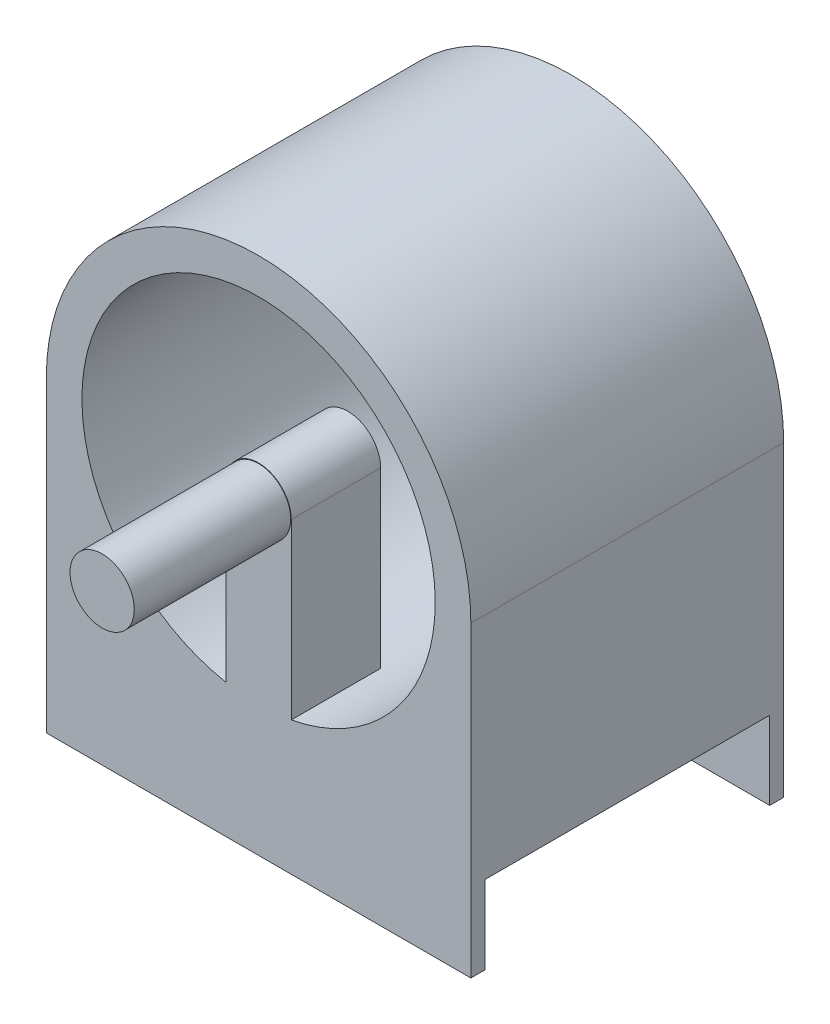
ISO-10303-21;
HEADER;
FILE_DESCRIPTION(('STEP AP214'),'2;1');
FILE_NAME('part.step','',(''),(''),'','','');
FILE_SCHEMA(('AUTOMOTIVE_DESIGN { 1 0 10303 214 1 1 1 1 }'));
ENDSEC;
DATA;
#1=APPLICATION_CONTEXT('core data for automotive mechanical design processes');
#2=APPLICATION_PROTOCOL_DEFINITION('international standard','automotive_design',2000,#1);
#3=PRODUCT_CONTEXT('',#1,'mechanical');
#4=PRODUCT('Part','Part','',(#3));
#5=PRODUCT_RELATED_PRODUCT_CATEGORY('part','',(#4));
#6=PRODUCT_DEFINITION_FORMATION('','',#4);
#7=PRODUCT_DEFINITION_CONTEXT('part definition',#1,'design');
#8=PRODUCT_DEFINITION('design','',#6,#7);
#9=PRODUCT_DEFINITION_SHAPE('','',#8);
#10=(LENGTH_UNIT() NAMED_UNIT(*) SI_UNIT(.MILLI.,.METRE.));
#11=(NAMED_UNIT(*) PLANE_ANGLE_UNIT() SI_UNIT($,.RADIAN.));
#12=(NAMED_UNIT(*) SI_UNIT($,.STERADIAN.) SOLID_ANGLE_UNIT());
#13=UNCERTAINTY_MEASURE_WITH_UNIT(LENGTH_MEASURE(1.E-05),#10,'distance_accuracy_value','');
#14=(GEOMETRIC_REPRESENTATION_CONTEXT(3) GLOBAL_UNCERTAINTY_ASSIGNED_CONTEXT((#13)) GLOBAL_UNIT_ASSIGNED_CONTEXT((#10,
#11,#12)) REPRESENTATION_CONTEXT('',''));
#15=CARTESIAN_POINT('',(0.,0.,0.));
#16=DIRECTION('',(0.,0.,1.));
#17=DIRECTION('',(1.,0.,0.));
#18=AXIS2_PLACEMENT_3D('',#15,#16,#17);
#19=CARTESIAN_POINT('',(19.,27.5,-14.));
#20=DIRECTION('',(0.,0.,1.));
#21=DIRECTION('',(1.,0.,0.));
#22=AXIS2_PLACEMENT_3D('',#19,#20,#21);
#23=CYLINDRICAL_SURFACE('',#22,15.81);
#24=CARTESIAN_POINT('',(19.,27.5,-14.));
#25=DIRECTION('',(0.,0.,1.));
#26=DIRECTION('',(1.,0.,0.));
#27=AXIS2_PLACEMENT_3D('',#24,#25,#26);
#28=CIRCLE('',#27,15.81);
#29=CARTESIAN_POINT('',(34.81,27.5,-14.));
#30=VERTEX_POINT('',#29);
#31=EDGE_CURVE('E178',#30,#30,#28,.T.);
#32=ORIENTED_EDGE('',*,*,#31,.F.);
#33=EDGE_LOOP('',(#32));
#34=FACE_BOUND('',#33,.T.);
#35=DIRECTION('',(0.,0.,1.));
#36=VECTOR('',#35,1.);
#37=CARTESIAN_POINT('',(21.925,11.9629322264463,6.));
#38=LINE('',#37,#36);
#39=CARTESIAN_POINT('',(21.925,11.9629322264463,6.));
#40=VERTEX_POINT('',#39);
#41=CARTESIAN_POINT('',(21.925,11.9629322264463,14.));
#42=VERTEX_POINT('',#41);
#43=EDGE_CURVE('E174',#40,#42,#38,.T.);
#44=ORIENTED_EDGE('',*,*,#43,.T.);
#45=CARTESIAN_POINT('',(19.,27.5,14.));
#46=DIRECTION('',(0.,0.,1.));
#47=DIRECTION('',(1.,0.,0.));
#48=AXIS2_PLACEMENT_3D('',#45,#46,#47);
#49=CIRCLE('',#48,15.81);
#50=CARTESIAN_POINT('',(16.075,11.9629322264463,14.));
#51=VERTEX_POINT('',#50);
#52=EDGE_CURVE('E177',#42,#51,#49,.T.);
#53=ORIENTED_EDGE('',*,*,#52,.T.);
#54=DIRECTION('',(0.,0.,1.));
#55=VECTOR('',#54,1.);
#56=CARTESIAN_POINT('',(16.075,11.9629322264463,6.));
#57=LINE('',#56,#55);
#58=CARTESIAN_POINT('',(16.075,11.9629322264463,6.));
#59=VERTEX_POINT('',#58);
#60=EDGE_CURVE('E61',#59,#51,#57,.T.);
#61=ORIENTED_EDGE('',*,*,#60,.F.);
#62=CARTESIAN_POINT('',(19.,27.5,6.));
#63=DIRECTION('',(0.,0.,1.));
#64=DIRECTION('',(1.,0.,0.));
#65=AXIS2_PLACEMENT_3D('',#62,#63,#64);
#66=CIRCLE('',#65,15.81);
#67=EDGE_CURVE('E65',#59,#40,#66,.T.);
#68=ORIENTED_EDGE('',*,*,#67,.T.);
#69=EDGE_LOOP('',(#44,#53,#61,#68));
#70=FACE_BOUND('',#69,.T.);
#71=ADVANCED_FACE('F45',(#34,#70),#23,.F.);
#72=CARTESIAN_POINT('',(38.,0.,14.));
#73=DIRECTION('',(0.,1.,0.));
#74=DIRECTION('',(0.,0.,1.));
#75=AXIS2_PLACEMENT_3D('',#72,#73,#74);
#76=PLANE('',#75);
#77=DIRECTION('',(0.,0.,-1.));
#78=VECTOR('',#77,1.);
#79=CARTESIAN_POINT('',(0.,0.,14.));
#80=LINE('',#79,#78);
#81=CARTESIAN_POINT('',(0.,0.,14.));
#82=VERTEX_POINT('',#81);
#83=CARTESIAN_POINT('',(0.,0.,12.75));
#84=VERTEX_POINT('',#83);
#85=EDGE_CURVE('E200',#82,#84,#80,.T.);
#86=ORIENTED_EDGE('',*,*,#85,.T.);
#87=DIRECTION('',(-1.,0.,0.));
#88=VECTOR('',#87,1.);
#89=CARTESIAN_POINT('',(38.,0.,12.75));
#90=LINE('',#89,#88);
#91=CARTESIAN_POINT('',(38.,0.,12.75));
#92=VERTEX_POINT('',#91);
#93=EDGE_CURVE('E54',#92,#84,#90,.T.);
#94=ORIENTED_EDGE('',*,*,#93,.F.);
#95=DIRECTION('',(0.,0.,-1.));
#96=VECTOR('',#95,1.);
#97=CARTESIAN_POINT('',(38.,0.,14.));
#98=LINE('',#97,#96);
#99=CARTESIAN_POINT('',(38.,0.,14.));
#100=VERTEX_POINT('',#99);
#101=EDGE_CURVE('E201',#100,#92,#98,.T.);
#102=ORIENTED_EDGE('',*,*,#101,.F.);
#103=DIRECTION('',(-1.,0.,0.));
#104=VECTOR('',#103,1.);
#105=CARTESIAN_POINT('',(38.,0.,14.));
#106=LINE('',#105,#104);
#107=EDGE_CURVE('E224',#100,#82,#106,.T.);
#108=ORIENTED_EDGE('',*,*,#107,.T.);
#109=EDGE_LOOP('',(#86,#94,#102,#108));
#110=FACE_BOUND('',#109,.T.);
#111=ADVANCED_FACE('F47',(#110),#76,.F.);
#112=CARTESIAN_POINT('',(38.,0.,12.75));
#113=DIRECTION('',(0.,0.,1.));
#114=DIRECTION('',(1.,0.,0.));
#115=AXIS2_PLACEMENT_3D('',#112,#113,#114);
#116=PLANE('',#115);
#117=DIRECTION('',(0.,1.,0.));
#118=VECTOR('',#117,1.);
#119=CARTESIAN_POINT('',(0.,0.,12.75));
#120=LINE('',#119,#118);
#121=CARTESIAN_POINT('',(0.,7.,12.75));
#122=VERTEX_POINT('',#121);
#123=EDGE_CURVE('E228',#84,#122,#120,.T.);
#124=ORIENTED_EDGE('',*,*,#123,.T.);
#125=DIRECTION('',(-1.,0.,0.));
#126=VECTOR('',#125,1.);
#127=CARTESIAN_POINT('',(38.,7.,12.75));
#128=LINE('',#127,#126);
#129=CARTESIAN_POINT('',(38.,7.,12.75));
#130=VERTEX_POINT('',#129);
#131=EDGE_CURVE('E260',#130,#122,#128,.T.);
#132=ORIENTED_EDGE('',*,*,#131,.F.);
#133=DIRECTION('',(0.,1.,0.));
#134=VECTOR('',#133,1.);
#135=CARTESIAN_POINT('',(38.,0.,12.75));
#136=LINE('',#135,#134);
#137=EDGE_CURVE('E205',#92,#130,#136,.T.);
#138=ORIENTED_EDGE('',*,*,#137,.F.);
#139=ORIENTED_EDGE('',*,*,#93,.T.);
#140=EDGE_LOOP('',(#124,#132,#138,#139));
#141=FACE_BOUND('',#140,.T.);
#142=ADVANCED_FACE('F267',(#141),#116,.F.);
#143=CARTESIAN_POINT('',(38.,7.,12.75));
#144=DIRECTION('',(0.,1.,0.));
#145=DIRECTION('',(0.,0.,1.));
#146=AXIS2_PLACEMENT_3D('',#143,#144,#145);
#147=PLANE('',#146);
#148=DIRECTION('',(0.,0.,-1.));
#149=VECTOR('',#148,1.);
#150=CARTESIAN_POINT('',(0.,7.,12.75));
#151=LINE('',#150,#149);
#152=CARTESIAN_POINT('',(0.,7.,-12.75));
#153=VERTEX_POINT('',#152);
#154=EDGE_CURVE('E231',#122,#153,#151,.T.);
#155=ORIENTED_EDGE('',*,*,#154,.T.);
#156=DIRECTION('',(-1.,0.,0.));
#157=VECTOR('',#156,1.);
#158=CARTESIAN_POINT('',(38.,7.,-12.75));
#159=LINE('',#158,#157);
#160=CARTESIAN_POINT('',(38.,7.,-12.75));
#161=VERTEX_POINT('',#160);
#162=EDGE_CURVE('E256',#161,#153,#159,.T.);
#163=ORIENTED_EDGE('',*,*,#162,.F.);
#164=DIRECTION('',(0.,0.,-1.));
#165=VECTOR('',#164,1.);
#166=CARTESIAN_POINT('',(38.,7.,12.75));
#167=LINE('',#166,#165);
#168=EDGE_CURVE('E209',#130,#161,#167,.T.);
#169=ORIENTED_EDGE('',*,*,#168,.F.);
#170=ORIENTED_EDGE('',*,*,#131,.T.);
#171=EDGE_LOOP('',(#155,#163,#169,#170));
#172=FACE_BOUND('',#171,.T.);
#173=ADVANCED_FACE('F280',(#172),#147,.F.);
#174=CARTESIAN_POINT('',(38.,7.,-12.75));
#175=DIRECTION('',(0.,0.,-1.));
#176=DIRECTION('',(0.,1.,0.));
#177=AXIS2_PLACEMENT_3D('',#174,#175,#176);
#178=PLANE('',#177);
#179=DIRECTION('',(0.,-1.,0.));
#180=VECTOR('',#179,1.);
#181=CARTESIAN_POINT('',(0.,7.,-12.75));
#182=LINE('',#181,#180);
#183=CARTESIAN_POINT('',(0.,0.,-12.75));
#184=VERTEX_POINT('',#183);
#185=EDGE_CURVE('E234',#153,#184,#182,.T.);
#186=ORIENTED_EDGE('',*,*,#185,.T.);
#187=DIRECTION('',(-1.,0.,0.));
#188=VECTOR('',#187,1.);
#189=CARTESIAN_POINT('',(38.,0.,-12.75));
#190=LINE('',#189,#188);
#191=CARTESIAN_POINT('',(38.,0.,-12.75));
#192=VERTEX_POINT('',#191);
#193=EDGE_CURVE('E252',#192,#184,#190,.T.);
#194=ORIENTED_EDGE('',*,*,#193,.F.);
#195=DIRECTION('',(0.,-1.,0.));
#196=VECTOR('',#195,1.);
#197=CARTESIAN_POINT('',(38.,7.,-12.75));
#198=LINE('',#197,#196);
#199=EDGE_CURVE('E212',#161,#192,#198,.T.);
#200=ORIENTED_EDGE('',*,*,#199,.F.);
#201=ORIENTED_EDGE('',*,*,#162,.T.);
#202=EDGE_LOOP('',(#186,#194,#200,#201));
#203=FACE_BOUND('',#202,.T.);
#204=ADVANCED_FACE('F284',(#203),#178,.F.);
#205=CARTESIAN_POINT('',(38.,0.,-12.75));
#206=DIRECTION('',(0.,1.,0.));
#207=DIRECTION('',(0.,0.,1.));
#208=AXIS2_PLACEMENT_3D('',#205,#206,#207);
#209=PLANE('',#208);
#210=DIRECTION('',(0.,0.,-1.));
#211=VECTOR('',#210,1.);
#212=CARTESIAN_POINT('',(0.,0.,-12.75));
#213=LINE('',#212,#211);
#214=CARTESIAN_POINT('',(0.,0.,-14.));
#215=VERTEX_POINT('',#214);
#216=EDGE_CURVE('E237',#184,#215,#213,.T.);
#217=ORIENTED_EDGE('',*,*,#216,.T.);
#218=DIRECTION('',(-1.,0.,0.));
#219=VECTOR('',#218,1.);
#220=CARTESIAN_POINT('',(38.,0.,-14.));
#221=LINE('',#220,#219);
#222=CARTESIAN_POINT('',(38.,0.,-14.));
#223=VERTEX_POINT('',#222);
#224=EDGE_CURVE('E248',#223,#215,#221,.T.);
#225=ORIENTED_EDGE('',*,*,#224,.F.);
#226=DIRECTION('',(0.,0.,-1.));
#227=VECTOR('',#226,1.);
#228=CARTESIAN_POINT('',(38.,0.,-12.75));
#229=LINE('',#228,#227);
#230=EDGE_CURVE('E215',#192,#223,#229,.T.);
#231=ORIENTED_EDGE('',*,*,#230,.F.);
#232=ORIENTED_EDGE('',*,*,#193,.T.);
#233=EDGE_LOOP('',(#217,#225,#231,#232));
#234=FACE_BOUND('',#233,.T.);
#235=ADVANCED_FACE('F303',(#234),#209,.F.);
#236=CARTESIAN_POINT('',(38.,0.,-14.));
#237=DIRECTION('',(0.,0.,1.));
#238=DIRECTION('',(1.,0.,0.));
#239=AXIS2_PLACEMENT_3D('',#236,#237,#238);
#240=PLANE('',#239);
#241=ORIENTED_EDGE('',*,*,#31,.T.);
#242=EDGE_LOOP('',(#241));
#243=FACE_BOUND('',#242,.T.);
#244=DIRECTION('',(0.,1.,0.));
#245=VECTOR('',#244,1.);
#246=CARTESIAN_POINT('',(0.,0.,-14.));
#247=LINE('',#246,#245);
#248=CARTESIAN_POINT('',(0.,27.5,-14.));
#249=VERTEX_POINT('',#248);
#250=EDGE_CURVE('E240',#215,#249,#247,.T.);
#251=ORIENTED_EDGE('',*,*,#250,.T.);
#252=CARTESIAN_POINT('',(19.,27.5,-14.));
#253=DIRECTION('',(0.,0.,1.));
#254=DIRECTION('',(1.,0.,0.));
#255=AXIS2_PLACEMENT_3D('',#252,#253,#254);
#256=CIRCLE('',#255,19.);
#257=CARTESIAN_POINT('',(38.,27.5,-14.));
#258=VERTEX_POINT('',#257);
#259=EDGE_CURVE('E182',#258,#249,#256,.T.);
#260=ORIENTED_EDGE('',*,*,#259,.F.);
#261=DIRECTION('',(0.,1.,0.));
#262=VECTOR('',#261,1.);
#263=CARTESIAN_POINT('',(38.,0.,-14.));
#264=LINE('',#263,#262);
#265=EDGE_CURVE('E218',#223,#258,#264,.T.);
#266=ORIENTED_EDGE('',*,*,#265,.F.);
#267=ORIENTED_EDGE('',*,*,#224,.T.);
#268=EDGE_LOOP('',(#251,#260,#266,#267));
#269=FACE_BOUND('',#268,.T.);
#270=ADVANCED_FACE('F300',(#243,#269),#240,.F.);
#271=CARTESIAN_POINT('',(38.,8.5,14.));
#272=DIRECTION('',(0.,0.,-1.));
#273=DIRECTION('',(-1.,0.,0.));
#274=AXIS2_PLACEMENT_3D('',#271,#272,#273);
#275=PLANE('',#274);
#276=CARTESIAN_POINT('',(19.,27.5,14.));
#277=DIRECTION('',(0.,0.,-1.));
#278=DIRECTION('',(-1.,0.,0.));
#279=AXIS2_PLACEMENT_3D('',#276,#277,#278);
#280=CIRCLE('',#279,2.875);
#281=CARTESIAN_POINT('',(16.125,27.5,14.));
#282=VERTEX_POINT('',#281);
#283=EDGE_CURVE('E11',#282,#282,#280,.F.);
#284=ORIENTED_EDGE('',*,*,#283,.F.);
#285=EDGE_LOOP('',(#284));
#286=FACE_BOUND('',#285,.T.);
#287=ORIENTED_EDGE('',*,*,#52,.F.);
#288=DIRECTION('',(0.,-1.,0.));
#289=VECTOR('',#288,1.);
#290=CARTESIAN_POINT('',(21.925,27.5,14.));
#291=LINE('',#290,#289);
#292=CARTESIAN_POINT('',(21.925,27.5,14.));
#293=VERTEX_POINT('',#292);
#294=EDGE_CURVE('E161',#293,#42,#291,.T.);
#295=ORIENTED_EDGE('',*,*,#294,.F.);
#296=CARTESIAN_POINT('',(19.,27.5,14.));
#297=DIRECTION('',(0.,0.,1.));
#298=DIRECTION('',(1.,0.,0.));
#299=AXIS2_PLACEMENT_3D('',#296,#297,#298);
#300=CIRCLE('',#299,2.925);
#301=CARTESIAN_POINT('',(16.075,27.5,14.));
#302=VERTEX_POINT('',#301);
#303=EDGE_CURVE('E168',#293,#302,#300,.T.);
#304=ORIENTED_EDGE('',*,*,#303,.T.);
#305=DIRECTION('',(0.,-1.,0.));
#306=VECTOR('',#305,1.);
#307=CARTESIAN_POINT('',(16.075,27.5,14.));
#308=LINE('',#307,#306);
#309=EDGE_CURVE('E139',#302,#51,#308,.T.);
#310=ORIENTED_EDGE('',*,*,#309,.T.);
#311=EDGE_LOOP('',(#287,#295,#304,#310));
#312=FACE_BOUND('',#311,.T.);
#313=DIRECTION('',(0.,-1.,0.));
#314=VECTOR('',#313,1.);
#315=CARTESIAN_POINT('',(0.,8.5,14.));
#316=LINE('',#315,#314);
#317=CARTESIAN_POINT('',(0.,27.5,14.));
#318=VERTEX_POINT('',#317);
#319=EDGE_CURVE('E206',#318,#82,#316,.T.);
#320=ORIENTED_EDGE('',*,*,#319,.T.);
#321=ORIENTED_EDGE('',*,*,#107,.F.);
#322=DIRECTION('',(0.,-1.,0.));
#323=VECTOR('',#322,1.);
#324=CARTESIAN_POINT('',(38.,8.5,14.));
#325=LINE('',#324,#323);
#326=CARTESIAN_POINT('',(38.,27.5,14.));
#327=VERTEX_POINT('',#326);
#328=EDGE_CURVE('E221',#327,#100,#325,.T.);
#329=ORIENTED_EDGE('',*,*,#328,.F.);
#330=CARTESIAN_POINT('',(19.,27.5,14.));
#331=DIRECTION('',(0.,0.,1.));
#332=DIRECTION('',(1.,0.,0.));
#333=AXIS2_PLACEMENT_3D('',#330,#331,#332);
#334=CIRCLE('',#333,19.);
#335=EDGE_CURVE('E185',#327,#318,#334,.T.);
#336=ORIENTED_EDGE('',*,*,#335,.T.);
#337=EDGE_LOOP('',(#320,#321,#329,#336));
#338=FACE_BOUND('',#337,.T.);
#339=ADVANCED_FACE('F293',(#286,#312,#338),#275,.F.);
#340=CARTESIAN_POINT('',(38.,0.,0.));
#341=DIRECTION('',(1.,0.,0.));
#342=DIRECTION('',(0.,0.,-1.));
#343=AXIS2_PLACEMENT_3D('',#340,#341,#342);
#344=PLANE('',#343);
#345=ORIENTED_EDGE('',*,*,#101,.T.);
#346=ORIENTED_EDGE('',*,*,#137,.T.);
#347=ORIENTED_EDGE('',*,*,#168,.T.);
#348=ORIENTED_EDGE('',*,*,#199,.T.);
#349=ORIENTED_EDGE('',*,*,#230,.T.);
#350=ORIENTED_EDGE('',*,*,#265,.T.);
#351=DIRECTION('',(0.,0.,-1.));
#352=VECTOR('',#351,1.);
#353=CARTESIAN_POINT('',(38.,27.5,14.));
#354=LINE('',#353,#352);
#355=EDGE_CURVE('E189',#327,#258,#354,.T.);
#356=ORIENTED_EDGE('',*,*,#355,.F.);
#357=ORIENTED_EDGE('',*,*,#328,.T.);
#358=EDGE_LOOP('',(#345,#346,#347,#348,#349,#350,#356,#357));
#359=FACE_BOUND('',#358,.T.);
#360=ADVANCED_FACE('F288',(#359),#344,.T.);
#361=CARTESIAN_POINT('',(0.,0.,0.));
#362=DIRECTION('',(1.,0.,0.));
#363=DIRECTION('',(0.,0.,-1.));
#364=AXIS2_PLACEMENT_3D('',#361,#362,#363);
#365=PLANE('',#364);
#366=ORIENTED_EDGE('',*,*,#85,.F.);
#367=ORIENTED_EDGE('',*,*,#319,.F.);
#368=DIRECTION('',(0.,0.,-1.));
#369=VECTOR('',#368,1.);
#370=CARTESIAN_POINT('',(0.,27.5,14.));
#371=LINE('',#370,#369);
#372=EDGE_CURVE('E196',#318,#249,#371,.T.);
#373=ORIENTED_EDGE('',*,*,#372,.T.);
#374=ORIENTED_EDGE('',*,*,#250,.F.);
#375=ORIENTED_EDGE('',*,*,#216,.F.);
#376=ORIENTED_EDGE('',*,*,#185,.F.);
#377=ORIENTED_EDGE('',*,*,#154,.F.);
#378=ORIENTED_EDGE('',*,*,#123,.F.);
#379=EDGE_LOOP('',(#366,#367,#373,#374,#375,#376,#377,#378));
#380=FACE_BOUND('',#379,.T.);
#381=ADVANCED_FACE('F274',(#380),#365,.F.);
#382=CARTESIAN_POINT('',(19.,27.5,14.));
#383=DIRECTION('',(0.,0.,-1.));
#384=DIRECTION('',(-1.,0.,0.));
#385=AXIS2_PLACEMENT_3D('',#382,#383,#384);
#386=CYLINDRICAL_SURFACE('',#385,19.);
#387=ORIENTED_EDGE('',*,*,#259,.T.);
#388=ORIENTED_EDGE('',*,*,#372,.F.);
#389=ORIENTED_EDGE('',*,*,#335,.F.);
#390=ORIENTED_EDGE('',*,*,#355,.T.);
#391=EDGE_LOOP('',(#387,#388,#389,#390));
#392=FACE_BOUND('',#391,.T.);
#393=ADVANCED_FACE('F296',(#392),#386,.T.);
#394=CARTESIAN_POINT('',(21.925,27.5,6.));
#395=DIRECTION('',(-1.,0.,0.));
#396=DIRECTION('',(0.,0.,1.));
#397=AXIS2_PLACEMENT_3D('',#394,#395,#396);
#398=PLANE('',#397);
#399=ORIENTED_EDGE('',*,*,#294,.T.);
#400=ORIENTED_EDGE('',*,*,#43,.F.);
#401=DIRECTION('',(0.,-1.,0.));
#402=VECTOR('',#401,1.);
#403=CARTESIAN_POINT('',(21.925,27.5,6.));
#404=LINE('',#403,#402);
#405=CARTESIAN_POINT('',(21.925,27.5,6.));
#406=VERTEX_POINT('',#405);
#407=EDGE_CURVE('E170',#406,#40,#404,.T.);
#408=ORIENTED_EDGE('',*,*,#407,.F.);
#409=DIRECTION('',(0.,0.,1.));
#410=VECTOR('',#409,1.);
#411=CARTESIAN_POINT('',(21.925,27.5,6.));
#412=LINE('',#411,#410);
#413=EDGE_CURVE('E145',#406,#293,#412,.T.);
#414=ORIENTED_EDGE('',*,*,#413,.T.);
#415=EDGE_LOOP('',(#399,#400,#408,#414));
#416=FACE_BOUND('',#415,.T.);
#417=ADVANCED_FACE('F324',(#416),#398,.F.);
#418=CARTESIAN_POINT('',(16.075,27.5,6.));
#419=DIRECTION('',(-1.,0.,0.));
#420=DIRECTION('',(0.,0.,1.));
#421=AXIS2_PLACEMENT_3D('',#418,#419,#420);
#422=PLANE('',#421);
#423=ORIENTED_EDGE('',*,*,#309,.F.);
#424=DIRECTION('',(0.,0.,1.));
#425=VECTOR('',#424,1.);
#426=CARTESIAN_POINT('',(16.075,27.5,6.));
#427=LINE('',#426,#425);
#428=CARTESIAN_POINT('',(16.075,27.5,6.));
#429=VERTEX_POINT('',#428);
#430=EDGE_CURVE('E134',#429,#302,#427,.T.);
#431=ORIENTED_EDGE('',*,*,#430,.F.);
#432=DIRECTION('',(0.,-1.,0.));
#433=VECTOR('',#432,1.);
#434=CARTESIAN_POINT('',(16.075,27.5,6.));
#435=LINE('',#434,#433);
#436=EDGE_CURVE('E137',#429,#59,#435,.T.);
#437=ORIENTED_EDGE('',*,*,#436,.T.);
#438=ORIENTED_EDGE('',*,*,#60,.T.);
#439=EDGE_LOOP('',(#423,#431,#437,#438));
#440=FACE_BOUND('',#439,.T.);
#441=ADVANCED_FACE('F136',(#440),#422,.T.);
#442=CARTESIAN_POINT('',(19.,27.5,6.));
#443=DIRECTION('',(0.,0.,1.));
#444=DIRECTION('',(1.,0.,0.));
#445=AXIS2_PLACEMENT_3D('',#442,#443,#444);
#446=CYLINDRICAL_SURFACE('',#445,2.925);
#447=ORIENTED_EDGE('',*,*,#303,.F.);
#448=ORIENTED_EDGE('',*,*,#413,.F.);
#449=CARTESIAN_POINT('',(19.,27.5,6.));
#450=DIRECTION('',(0.,0.,1.));
#451=DIRECTION('',(1.,0.,0.));
#452=AXIS2_PLACEMENT_3D('',#449,#450,#451);
#453=CIRCLE('',#452,2.925);
#454=EDGE_CURVE('E150',#406,#429,#453,.T.);
#455=ORIENTED_EDGE('',*,*,#454,.T.);
#456=ORIENTED_EDGE('',*,*,#430,.T.);
#457=EDGE_LOOP('',(#447,#448,#455,#456));
#458=FACE_BOUND('',#457,.T.);
#459=ADVANCED_FACE('F153',(#458),#446,.T.);
#460=CARTESIAN_POINT('',(19.,27.5,6.));
#461=DIRECTION('',(0.,0.,1.));
#462=DIRECTION('',(1.,0.,0.));
#463=AXIS2_PLACEMENT_3D('',#460,#461,#462);
#464=PLANE('',#463);
#465=ORIENTED_EDGE('',*,*,#407,.T.);
#466=ORIENTED_EDGE('',*,*,#67,.F.);
#467=ORIENTED_EDGE('',*,*,#436,.F.);
#468=ORIENTED_EDGE('',*,*,#454,.F.);
#469=EDGE_LOOP('',(#465,#466,#467,#468));
#470=FACE_BOUND('',#469,.T.);
#471=ADVANCED_FACE('F149',(#470),#464,.F.);
#472=CARTESIAN_POINT('',(19.,27.5,28.));
#473=DIRECTION('',(0.,0.,-1.));
#474=DIRECTION('',(-1.,0.,0.));
#475=AXIS2_PLACEMENT_3D('',#472,#473,#474);
#476=CYLINDRICAL_SURFACE('',#475,2.875);
#477=CARTESIAN_POINT('',(19.,27.5,28.));
#478=DIRECTION('',(0.,0.,1.));
#479=DIRECTION('',(1.,0.,0.));
#480=AXIS2_PLACEMENT_3D('',#477,#478,#479);
#481=CIRCLE('',#480,2.875);
#482=CARTESIAN_POINT('',(21.875,27.5,28.));
#483=VERTEX_POINT('',#482);
#484=EDGE_CURVE('E165',#483,#483,#481,.T.);
#485=ORIENTED_EDGE('',*,*,#484,.F.);
#486=EDGE_LOOP('',(#485));
#487=FACE_BOUND('',#486,.T.);
#488=ORIENTED_EDGE('',*,*,#283,.T.);
#489=EDGE_LOOP('',(#488));
#490=FACE_BOUND('',#489,.T.);
#491=ADVANCED_FACE('F352',(#487,#490),#476,.T.);
#492=CARTESIAN_POINT('',(19.,27.5,28.));
#493=DIRECTION('',(0.,0.,1.));
#494=DIRECTION('',(1.,0.,0.));
#495=AXIS2_PLACEMENT_3D('',#492,#493,#494);
#496=PLANE('',#495);
#497=ORIENTED_EDGE('',*,*,#484,.T.);
#498=EDGE_LOOP('',(#497));
#499=FACE_BOUND('',#498,.T.);
#500=ADVANCED_FACE('F350',(#499),#496,.T.);
#501=CLOSED_SHELL('',(#71,#111,#142,#173,#204,#235,#270,#339,#360,#381,#393,#417,#441,#459,#471,
#491,#500));
#502=MANIFOLD_SOLID_BREP('B2',#501);
#503=ADVANCED_BREP_SHAPE_REPRESENTATION('',(#18,#502),#14);
#504=SHAPE_DEFINITION_REPRESENTATION(#9,#503);
ENDSEC;
END-ISO-10303-21;
